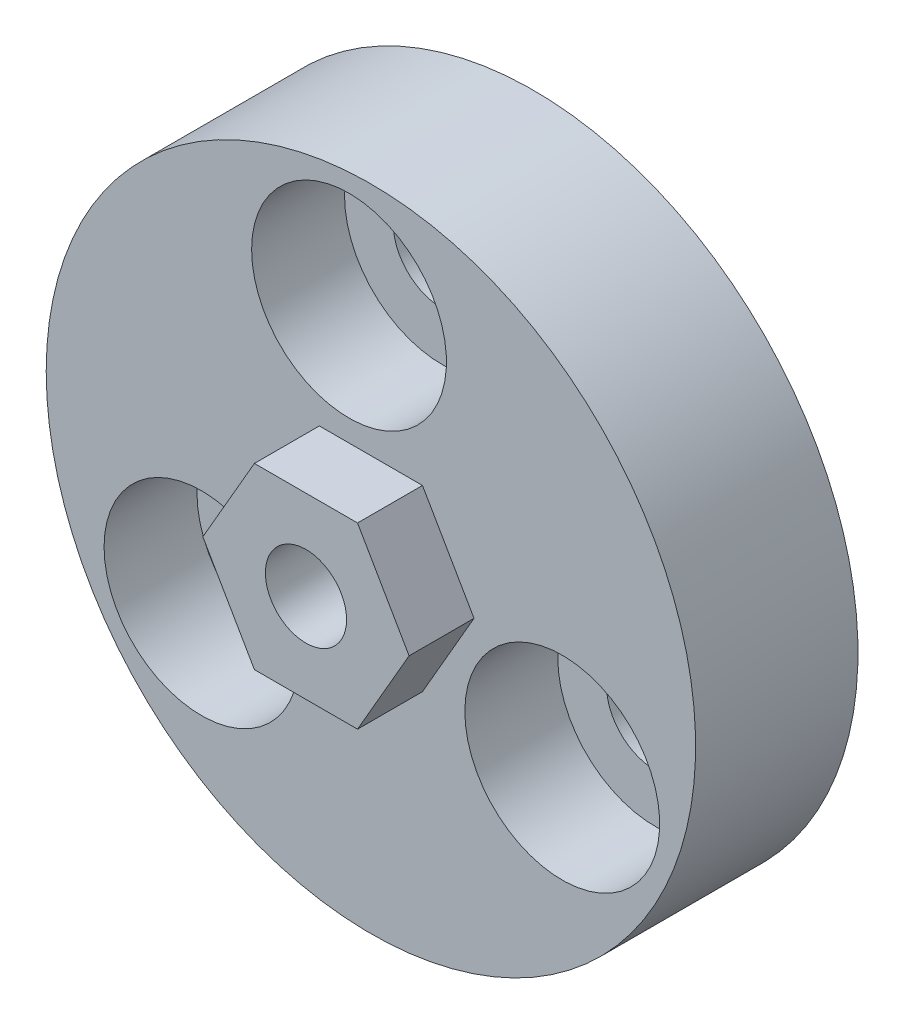
ISO-10303-21;
HEADER;
FILE_DESCRIPTION(('STEP AP214'),'2;1');
FILE_NAME('part.step','',(''),(''),'','','');
FILE_SCHEMA(('AUTOMOTIVE_DESIGN { 1 0 10303 214 1 1 1 1 }'));
ENDSEC;
DATA;
#1=APPLICATION_CONTEXT('core data for automotive mechanical design processes');
#2=APPLICATION_PROTOCOL_DEFINITION('international standard','automotive_design',2000,#1);
#3=PRODUCT_CONTEXT('',#1,'mechanical');
#4=PRODUCT('Part','Part','',(#3));
#5=PRODUCT_RELATED_PRODUCT_CATEGORY('part','',(#4));
#6=PRODUCT_DEFINITION_FORMATION('','',#4);
#7=PRODUCT_DEFINITION_CONTEXT('part definition',#1,'design');
#8=PRODUCT_DEFINITION('design','',#6,#7);
#9=PRODUCT_DEFINITION_SHAPE('','',#8);
#10=(LENGTH_UNIT() NAMED_UNIT(*) SI_UNIT(.MILLI.,.METRE.));
#11=(NAMED_UNIT(*) PLANE_ANGLE_UNIT() SI_UNIT($,.RADIAN.));
#12=(NAMED_UNIT(*) SI_UNIT($,.STERADIAN.) SOLID_ANGLE_UNIT());
#13=UNCERTAINTY_MEASURE_WITH_UNIT(LENGTH_MEASURE(1.E-05),#10,'distance_accuracy_value','');
#14=(GEOMETRIC_REPRESENTATION_CONTEXT(3) GLOBAL_UNCERTAINTY_ASSIGNED_CONTEXT((#13)) GLOBAL_UNIT_ASSIGNED_CONTEXT((#10,
#11,#12)) REPRESENTATION_CONTEXT('',''));
#15=CARTESIAN_POINT('',(0.,0.,0.));
#16=DIRECTION('',(0.,0.,1.));
#17=DIRECTION('',(1.,0.,0.));
#18=AXIS2_PLACEMENT_3D('',#15,#16,#17);
#19=CARTESIAN_POINT('',(-150.000000000003,407.52439115089,-364.357743681072));
#20=DIRECTION('',(0.,0.,1.));
#21=DIRECTION('',(1.,0.,0.));
#22=AXIS2_PLACEMENT_3D('',#19,#20,#21);
#23=PLANE('',#22);
#24=CARTESIAN_POINT('',(-150.000000000003,407.52439115089,-364.357743681072));
#25=DIRECTION('',(0.,0.,1.));
#26=DIRECTION('',(1.,0.,0.));
#27=AXIS2_PLACEMENT_3D('',#24,#25,#26);
#28=CIRCLE('',#27,1.25);
#29=CARTESIAN_POINT('',(-148.750000000003,407.52439115089,-364.357743681072));
#30=VERTEX_POINT('',#29);
#31=EDGE_CURVE('E20',#30,#30,#28,.F.);
#32=ORIENTED_EDGE('',*,*,#31,.T.);
#33=EDGE_LOOP('',(#32));
#34=FACE_BOUND('',#33,.T.);
#35=DIRECTION('',(0.500000000000038,-0.866025403784417,0.));
#36=VECTOR('',#35,1.);
#37=CARTESIAN_POINT('',(-151.587713240275,404.77439115089,-364.357743681072));
#38=LINE('',#37,#36);
#39=CARTESIAN_POINT('',(-151.587713240275,404.77439115089,-364.357743681072));
#40=VERTEX_POINT('',#39);
#41=CARTESIAN_POINT('',(-153.175426480546,407.52439115089,-364.357743681072));
#42=VERTEX_POINT('',#41);
#43=EDGE_CURVE('E68',#40,#42,#38,.F.);
#44=ORIENTED_EDGE('',*,*,#43,.F.);
#45=DIRECTION('',(1.,0.,0.));
#46=VECTOR('',#45,1.);
#47=CARTESIAN_POINT('',(-148.412286759732,404.77439115089,-364.357743681072));
#48=LINE('',#47,#46);
#49=CARTESIAN_POINT('',(-148.412286759732,404.77439115089,-364.357743681072));
#50=VERTEX_POINT('',#49);
#51=EDGE_CURVE('E70',#50,#40,#48,.F.);
#52=ORIENTED_EDGE('',*,*,#51,.F.);
#53=DIRECTION('',(0.5,0.866025403784438,0.));
#54=VECTOR('',#53,1.);
#55=CARTESIAN_POINT('',(-146.824573519461,407.52439115089,-364.357743681072));
#56=LINE('',#55,#54);
#57=CARTESIAN_POINT('',(-146.824573519461,407.52439115089,-364.357743681072));
#58=VERTEX_POINT('',#57);
#59=EDGE_CURVE('E72',#58,#50,#56,.F.);
#60=ORIENTED_EDGE('',*,*,#59,.F.);
#61=DIRECTION('',(-0.499999999999914,0.866025403784488,0.));
#62=VECTOR('',#61,1.);
#63=CARTESIAN_POINT('',(-148.412286759732,410.27439115089,-364.357743681072));
#64=LINE('',#63,#62);
#65=CARTESIAN_POINT('',(-148.412286759732,410.27439115089,-364.357743681072));
#66=VERTEX_POINT('',#65);
#67=EDGE_CURVE('E161',#66,#58,#64,.F.);
#68=ORIENTED_EDGE('',*,*,#67,.F.);
#69=DIRECTION('',(1.,0.,0.));
#70=VECTOR('',#69,1.);
#71=CARTESIAN_POINT('',(-151.587713240275,410.27439115089,-364.357743681072));
#72=LINE('',#71,#70);
#73=CARTESIAN_POINT('',(-151.587713240275,410.27439115089,-364.357743681072));
#74=VERTEX_POINT('',#73);
#75=EDGE_CURVE('E166',#74,#66,#72,.T.);
#76=ORIENTED_EDGE('',*,*,#75,.F.);
#77=DIRECTION('',(-0.5,-0.866025403784438,0.));
#78=VECTOR('',#77,1.);
#79=CARTESIAN_POINT('',(-153.175426480546,407.52439115089,-364.357743681072));
#80=LINE('',#79,#78);
#81=EDGE_CURVE('E171',#42,#74,#80,.F.);
#82=ORIENTED_EDGE('',*,*,#81,.F.);
#83=EDGE_LOOP('',(#44,#52,#60,#68,#76,#82));
#84=FACE_BOUND('',#83,.T.);
#85=ADVANCED_FACE('F17',(#34,#84),#23,.T.);
#86=CARTESIAN_POINT('',(-146.824573519461,407.52439115089,-366.357743681072));
#87=DIRECTION('',(0.866025403784438,-0.5,0.));
#88=DIRECTION('',(0.5,0.866025403784438,0.));
#89=AXIS2_PLACEMENT_3D('',#86,#87,#88);
#90=PLANE('',#89);
#91=DIRECTION('',(-0.499999999999882,-0.866025403784507,0.));
#92=VECTOR('',#91,1.);
#93=CARTESIAN_POINT('',(-146.824573519461,407.52439115089,-366.357743681072));
#94=LINE('',#93,#92);
#95=CARTESIAN_POINT('',(-146.824573519461,407.52439115089,-366.357743681072));
#96=VERTEX_POINT('',#95);
#97=CARTESIAN_POINT('',(-148.412286759732,404.77439115089,-366.357743681072));
#98=VERTEX_POINT('',#97);
#99=EDGE_CURVE('E157',#96,#98,#94,.T.);
#100=ORIENTED_EDGE('',*,*,#99,.F.);
#101=DIRECTION('',(0.,0.,1.));
#102=VECTOR('',#101,1.);
#103=CARTESIAN_POINT('',(-146.824573519461,407.52439115089,-366.357743681072));
#104=LINE('',#103,#102);
#105=EDGE_CURVE('E83',#58,#96,#104,.F.);
#106=ORIENTED_EDGE('',*,*,#105,.F.);
#107=ORIENTED_EDGE('',*,*,#59,.T.);
#108=DIRECTION('',(0.,0.,-1.));
#109=VECTOR('',#108,1.);
#110=CARTESIAN_POINT('',(-148.412286759732,404.77439115089,-366.357743681072));
#111=LINE('',#110,#109);
#112=EDGE_CURVE('E77',#98,#50,#111,.F.);
#113=ORIENTED_EDGE('',*,*,#112,.F.);
#114=EDGE_LOOP('',(#100,#106,#107,#113));
#115=FACE_BOUND('',#114,.T.);
#116=ADVANCED_FACE('F80',(#115),#90,.T.);
#117=CARTESIAN_POINT('',(-148.412286759732,404.77439115089,-366.357743681072));
#118=DIRECTION('',(0.,-1.,0.));
#119=DIRECTION('',(0.,0.,-1.));
#120=AXIS2_PLACEMENT_3D('',#117,#118,#119);
#121=PLANE('',#120);
#122=DIRECTION('',(1.,0.,0.));
#123=VECTOR('',#122,1.);
#124=CARTESIAN_POINT('',(-150.000000000003,404.77439115089,-366.357743681072));
#125=LINE('',#124,#123);
#126=CARTESIAN_POINT('',(-151.587713240275,404.77439115089,-366.357743681072));
#127=VERTEX_POINT('',#126);
#128=EDGE_CURVE('E88',#98,#127,#125,.F.);
#129=ORIENTED_EDGE('',*,*,#128,.F.);
#130=ORIENTED_EDGE('',*,*,#112,.T.);
#131=ORIENTED_EDGE('',*,*,#51,.T.);
#132=DIRECTION('',(0.,0.,1.));
#133=VECTOR('',#132,1.);
#134=CARTESIAN_POINT('',(-151.587713240275,404.77439115089,-366.357743681072));
#135=LINE('',#134,#133);
#136=EDGE_CURVE('E91',#127,#40,#135,.T.);
#137=ORIENTED_EDGE('',*,*,#136,.F.);
#138=EDGE_LOOP('',(#129,#130,#131,#137));
#139=FACE_BOUND('',#138,.T.);
#140=ADVANCED_FACE('F86',(#139),#121,.T.);
#141=CARTESIAN_POINT('',(-151.587713240275,404.77439115089,-366.357743681072));
#142=DIRECTION('',(-0.866025403784417,-0.500000000000038,0.));
#143=DIRECTION('',(0.500000000000038,-0.866025403784417,0.));
#144=AXIS2_PLACEMENT_3D('',#141,#142,#143);
#145=PLANE('',#144);
#146=DIRECTION('',(-0.499999999999888,0.866025403784503,0.));
#147=VECTOR('',#146,1.);
#148=CARTESIAN_POINT('',(-151.587713240275,404.77439115089,-366.357743681072));
#149=LINE('',#148,#147);
#150=CARTESIAN_POINT('',(-153.175426480546,407.52439115089,-366.357743681072));
#151=VERTEX_POINT('',#150);
#152=EDGE_CURVE('E153',#127,#151,#149,.T.);
#153=ORIENTED_EDGE('',*,*,#152,.F.);
#154=ORIENTED_EDGE('',*,*,#136,.T.);
#155=ORIENTED_EDGE('',*,*,#43,.T.);
#156=DIRECTION('',(0.,0.,1.));
#157=VECTOR('',#156,1.);
#158=CARTESIAN_POINT('',(-153.175426480546,407.52439115089,-366.357743681072));
#159=LINE('',#158,#157);
#160=EDGE_CURVE('E168',#151,#42,#159,.T.);
#161=ORIENTED_EDGE('',*,*,#160,.F.);
#162=EDGE_LOOP('',(#153,#154,#155,#161));
#163=FACE_BOUND('',#162,.T.);
#164=ADVANCED_FACE('F175',(#163),#145,.T.);
#165=CARTESIAN_POINT('',(-153.175426480546,407.52439115089,-366.357743681072));
#166=DIRECTION('',(-0.866025403784438,0.5,0.));
#167=DIRECTION('',(-0.5,-0.866025403784438,0.));
#168=AXIS2_PLACEMENT_3D('',#165,#166,#167);
#169=PLANE('',#168);
#170=DIRECTION('',(0.499999999999896,0.866025403784499,0.));
#171=VECTOR('',#170,1.);
#172=CARTESIAN_POINT('',(-153.175426480546,407.52439115089,-366.357743681072));
#173=LINE('',#172,#171);
#174=CARTESIAN_POINT('',(-151.587713240275,410.27439115089,-366.357743681072));
#175=VERTEX_POINT('',#174);
#176=EDGE_CURVE('E148',#151,#175,#173,.T.);
#177=ORIENTED_EDGE('',*,*,#176,.F.);
#178=ORIENTED_EDGE('',*,*,#160,.T.);
#179=ORIENTED_EDGE('',*,*,#81,.T.);
#180=DIRECTION('',(0.,0.,1.));
#181=VECTOR('',#180,1.);
#182=CARTESIAN_POINT('',(-151.587713240275,410.27439115089,-366.357743681072));
#183=LINE('',#182,#181);
#184=EDGE_CURVE('E163',#175,#74,#183,.T.);
#185=ORIENTED_EDGE('',*,*,#184,.F.);
#186=EDGE_LOOP('',(#177,#178,#179,#185));
#187=FACE_BOUND('',#186,.T.);
#188=ADVANCED_FACE('F183',(#187),#169,.T.);
#189=CARTESIAN_POINT('',(-151.587713240275,410.27439115089,-366.357743681072));
#190=DIRECTION('',(0.,1.,0.));
#191=DIRECTION('',(0.,0.,1.));
#192=AXIS2_PLACEMENT_3D('',#189,#190,#191);
#193=PLANE('',#192);
#194=DIRECTION('',(1.,0.,0.));
#195=VECTOR('',#194,1.);
#196=CARTESIAN_POINT('',(-150.000000000003,410.27439115089,-366.357743681072));
#197=LINE('',#196,#195);
#198=CARTESIAN_POINT('',(-148.412286759732,410.27439115089,-366.357743681072));
#199=VERTEX_POINT('',#198);
#200=EDGE_CURVE('E144',#175,#199,#197,.T.);
#201=ORIENTED_EDGE('',*,*,#200,.F.);
#202=ORIENTED_EDGE('',*,*,#184,.T.);
#203=ORIENTED_EDGE('',*,*,#75,.T.);
#204=DIRECTION('',(0.,0.,1.));
#205=VECTOR('',#204,1.);
#206=CARTESIAN_POINT('',(-148.412286759732,410.27439115089,-366.357743681072));
#207=LINE('',#206,#205);
#208=EDGE_CURVE('E35',#199,#66,#207,.T.);
#209=ORIENTED_EDGE('',*,*,#208,.F.);
#210=EDGE_LOOP('',(#201,#202,#203,#209));
#211=FACE_BOUND('',#210,.T.);
#212=ADVANCED_FACE('F181',(#211),#193,.T.);
#213=CARTESIAN_POINT('',(-148.412286759732,410.27439115089,-366.357743681072));
#214=DIRECTION('',(0.866025403784488,0.499999999999914,0.));
#215=DIRECTION('',(-0.499999999999914,0.866025403784488,0.));
#216=AXIS2_PLACEMENT_3D('',#213,#214,#215);
#217=PLANE('',#216);
#218=DIRECTION('',(0.499999999999889,-0.866025403784503,0.));
#219=VECTOR('',#218,1.);
#220=CARTESIAN_POINT('',(-148.412286759732,410.27439115089,-366.357743681072));
#221=LINE('',#220,#219);
#222=EDGE_CURVE('E140',#199,#96,#221,.T.);
#223=ORIENTED_EDGE('',*,*,#222,.F.);
#224=ORIENTED_EDGE('',*,*,#208,.T.);
#225=ORIENTED_EDGE('',*,*,#67,.T.);
#226=ORIENTED_EDGE('',*,*,#105,.T.);
#227=EDGE_LOOP('',(#223,#224,#225,#226));
#228=FACE_BOUND('',#227,.T.);
#229=ADVANCED_FACE('F180',(#228),#217,.T.);
#230=CARTESIAN_POINT('',(-144.107631798208,404.900939803051,-367.719674790643));
#231=DIRECTION('',(0.,0.,-1.));
#232=DIRECTION('',(-1.,0.,0.));
#233=AXIS2_PLACEMENT_3D('',#230,#231,#232);
#234=CYLINDRICAL_SURFACE('',#233,3.);
#235=CARTESIAN_POINT('',(-144.107631798208,404.900939803051,-369.219674790643));
#236=DIRECTION('',(0.,0.,-1.));
#237=DIRECTION('',(-1.,0.,0.));
#238=AXIS2_PLACEMENT_3D('',#235,#236,#237);
#239=CIRCLE('',#238,3.);
#240=CARTESIAN_POINT('',(-147.107631798208,404.900939803051,-369.219674790643));
#241=VERTEX_POINT('',#240);
#242=EDGE_CURVE('E130',#241,#241,#239,.T.);
#243=ORIENTED_EDGE('',*,*,#242,.T.);
#244=EDGE_LOOP('',(#243));
#245=FACE_BOUND('',#244,.T.);
#246=CARTESIAN_POINT('',(-144.107631798208,404.900939803051,-366.357743681072));
#247=DIRECTION('',(0.,0.,-1.));
#248=DIRECTION('',(-1.,0.,0.));
#249=AXIS2_PLACEMENT_3D('',#246,#247,#248);
#250=CIRCLE('',#249,3.);
#251=CARTESIAN_POINT('',(-147.107631798208,404.900939803051,-366.357743681072));
#252=VERTEX_POINT('',#251);
#253=EDGE_CURVE('E138',#252,#252,#250,.T.);
#254=ORIENTED_EDGE('',*,*,#253,.F.);
#255=EDGE_LOOP('',(#254));
#256=FACE_BOUND('',#255,.T.);
#257=ADVANCED_FACE('F251',(#245,#256),#234,.F.);
#258=CARTESIAN_POINT('',(-155.21815961372,403.733176273602,-367.719674790643));
#259=DIRECTION('',(0.,0.,-1.));
#260=DIRECTION('',(-1.,0.,0.));
#261=AXIS2_PLACEMENT_3D('',#258,#259,#260);
#262=CYLINDRICAL_SURFACE('',#261,3.);
#263=CARTESIAN_POINT('',(-155.21815961372,403.733176273602,-369.219674790643));
#264=DIRECTION('',(0.,0.,-1.));
#265=DIRECTION('',(-1.,0.,0.));
#266=AXIS2_PLACEMENT_3D('',#263,#264,#265);
#267=CIRCLE('',#266,3.);
#268=CARTESIAN_POINT('',(-158.21815961372,403.733176273602,-369.219674790643));
#269=VERTEX_POINT('',#268);
#270=EDGE_CURVE('E127',#269,#269,#267,.T.);
#271=ORIENTED_EDGE('',*,*,#270,.T.);
#272=EDGE_LOOP('',(#271));
#273=FACE_BOUND('',#272,.T.);
#274=CARTESIAN_POINT('',(-155.21815961372,403.733176273602,-366.357743681072));
#275=DIRECTION('',(0.,0.,-1.));
#276=DIRECTION('',(-1.,0.,0.));
#277=AXIS2_PLACEMENT_3D('',#274,#275,#276);
#278=CIRCLE('',#277,3.);
#279=CARTESIAN_POINT('',(-158.21815961372,403.733176273602,-366.357743681072));
#280=VERTEX_POINT('',#279);
#281=EDGE_CURVE('E136',#280,#280,#278,.T.);
#282=ORIENTED_EDGE('',*,*,#281,.F.);
#283=EDGE_LOOP('',(#282));
#284=FACE_BOUND('',#283,.T.);
#285=ADVANCED_FACE('F247',(#273,#284),#262,.F.);
#286=CARTESIAN_POINT('',(-150.67420858808,413.939057376015,-367.719674790643));
#287=DIRECTION('',(0.,0.,-1.));
#288=DIRECTION('',(-1.,0.,0.));
#289=AXIS2_PLACEMENT_3D('',#286,#287,#288);
#290=CYLINDRICAL_SURFACE('',#289,3.);
#291=CARTESIAN_POINT('',(-150.67420858808,413.939057376015,-369.219674790643));
#292=DIRECTION('',(0.,0.,-1.));
#293=DIRECTION('',(-1.,0.,0.));
#294=AXIS2_PLACEMENT_3D('',#291,#292,#293);
#295=CIRCLE('',#294,3.);
#296=CARTESIAN_POINT('',(-153.67420858808,413.939057376015,-369.219674790643));
#297=VERTEX_POINT('',#296);
#298=EDGE_CURVE('E124',#297,#297,#295,.T.);
#299=ORIENTED_EDGE('',*,*,#298,.T.);
#300=EDGE_LOOP('',(#299));
#301=FACE_BOUND('',#300,.T.);
#302=CARTESIAN_POINT('',(-150.67420858808,413.939057376015,-366.357743681072));
#303=DIRECTION('',(0.,0.,-1.));
#304=DIRECTION('',(-1.,0.,0.));
#305=AXIS2_PLACEMENT_3D('',#302,#303,#304);
#306=CIRCLE('',#305,3.);
#307=CARTESIAN_POINT('',(-153.67420858808,413.939057376015,-366.357743681072));
#308=VERTEX_POINT('',#307);
#309=EDGE_CURVE('E133',#308,#308,#306,.T.);
#310=ORIENTED_EDGE('',*,*,#309,.F.);
#311=EDGE_LOOP('',(#310));
#312=FACE_BOUND('',#311,.T.);
#313=ADVANCED_FACE('F243',(#301,#312),#290,.F.);
#314=CARTESIAN_POINT('',(-150.000000000003,407.52439115089,-362.423969756685));
#315=DIRECTION('',(0.,0.,1.));
#316=DIRECTION('',(1.,0.,0.));
#317=AXIS2_PLACEMENT_3D('',#314,#315,#316);
#318=CYLINDRICAL_SURFACE('',#317,1.25);
#319=ORIENTED_EDGE('',*,*,#31,.F.);
#320=EDGE_LOOP('',(#319));
#321=FACE_BOUND('',#320,.T.);
#322=CARTESIAN_POINT('',(-150.000000000003,407.52439115089,-369.357743681072));
#323=DIRECTION('',(0.,0.,1.));
#324=DIRECTION('',(1.,0.,0.));
#325=AXIS2_PLACEMENT_3D('',#322,#323,#324);
#326=CIRCLE('',#325,1.25);
#327=CARTESIAN_POINT('',(-148.750000000003,407.52439115089,-369.357743681072));
#328=VERTEX_POINT('',#327);
#329=EDGE_CURVE('E121',#328,#328,#326,.F.);
#330=ORIENTED_EDGE('',*,*,#329,.T.);
#331=EDGE_LOOP('',(#330));
#332=FACE_BOUND('',#331,.T.);
#333=ADVANCED_FACE('F239',(#321,#332),#318,.F.);
#334=CARTESIAN_POINT('',(-150.000000000003,407.52439115089,-366.357743681072));
#335=DIRECTION('',(0.,0.,1.));
#336=DIRECTION('',(1.,0.,0.));
#337=AXIS2_PLACEMENT_3D('',#334,#335,#336);
#338=PLANE('',#337);
#339=ORIENTED_EDGE('',*,*,#309,.T.);
#340=EDGE_LOOP('',(#339));
#341=FACE_BOUND('',#340,.T.);
#342=ORIENTED_EDGE('',*,*,#281,.T.);
#343=EDGE_LOOP('',(#342));
#344=FACE_BOUND('',#343,.T.);
#345=ORIENTED_EDGE('',*,*,#253,.T.);
#346=EDGE_LOOP('',(#345));
#347=FACE_BOUND('',#346,.T.);
#348=ORIENTED_EDGE('',*,*,#200,.T.);
#349=ORIENTED_EDGE('',*,*,#222,.T.);
#350=ORIENTED_EDGE('',*,*,#99,.T.);
#351=ORIENTED_EDGE('',*,*,#128,.T.);
#352=ORIENTED_EDGE('',*,*,#152,.T.);
#353=ORIENTED_EDGE('',*,*,#176,.T.);
#354=EDGE_LOOP('',(#348,#349,#350,#351,#352,#353));
#355=FACE_BOUND('',#354,.T.);
#356=CARTESIAN_POINT('',(-150.000000000003,407.52439115089,-366.357743681072));
#357=DIRECTION('',(0.,0.,-1.));
#358=DIRECTION('',(-1.,0.,0.));
#359=AXIS2_PLACEMENT_3D('',#356,#357,#358);
#360=CIRCLE('',#359,10.);
#361=CARTESIAN_POINT('',(-160.000000000003,407.52439115089,-366.357743681072));
#362=VERTEX_POINT('',#361);
#363=EDGE_CURVE('E118',#362,#362,#360,.T.);
#364=ORIENTED_EDGE('',*,*,#363,.F.);
#365=EDGE_LOOP('',(#364));
#366=FACE_BOUND('',#365,.T.);
#367=ADVANCED_FACE('F177',(#341,#344,#347,#355,#366),#338,.T.);
#368=CARTESIAN_POINT('',(-144.107631798208,404.900939803051,-369.219674790643));
#369=DIRECTION('',(0.,0.,-1.));
#370=DIRECTION('',(-1.,0.,0.));
#371=AXIS2_PLACEMENT_3D('',#368,#369,#370);
#372=PLANE('',#371);
#373=CARTESIAN_POINT('',(-144.107631798208,404.900939803051,-369.219674790643));
#374=DIRECTION('',(0.,0.,-1.));
#375=DIRECTION('',(-1.,0.,0.));
#376=AXIS2_PLACEMENT_3D('',#373,#374,#375);
#377=CIRCLE('',#376,1.5);
#378=CARTESIAN_POINT('',(-145.607631798208,404.900939803051,-369.219674790643));
#379=VERTEX_POINT('',#378);
#380=EDGE_CURVE('E115',#379,#379,#377,.T.);
#381=ORIENTED_EDGE('',*,*,#380,.T.);
#382=EDGE_LOOP('',(#381));
#383=FACE_BOUND('',#382,.T.);
#384=ORIENTED_EDGE('',*,*,#242,.F.);
#385=EDGE_LOOP('',(#384));
#386=FACE_BOUND('',#385,.T.);
#387=ADVANCED_FACE('F232',(#383,#386),#372,.F.);
#388=CARTESIAN_POINT('',(-155.21815961372,403.733176273602,-369.219674790643));
#389=DIRECTION('',(0.,0.,-1.));
#390=DIRECTION('',(-1.,0.,0.));
#391=AXIS2_PLACEMENT_3D('',#388,#389,#390);
#392=PLANE('',#391);
#393=CARTESIAN_POINT('',(-155.21815961372,403.733176273602,-369.219674790643));
#394=DIRECTION('',(0.,0.,-1.));
#395=DIRECTION('',(-1.,0.,0.));
#396=AXIS2_PLACEMENT_3D('',#393,#394,#395);
#397=CIRCLE('',#396,1.5);
#398=CARTESIAN_POINT('',(-156.71815961372,403.733176273602,-369.219674790643));
#399=VERTEX_POINT('',#398);
#400=EDGE_CURVE('E112',#399,#399,#397,.T.);
#401=ORIENTED_EDGE('',*,*,#400,.T.);
#402=EDGE_LOOP('',(#401));
#403=FACE_BOUND('',#402,.T.);
#404=ORIENTED_EDGE('',*,*,#270,.F.);
#405=EDGE_LOOP('',(#404));
#406=FACE_BOUND('',#405,.T.);
#407=ADVANCED_FACE('F228',(#403,#406),#392,.F.);
#408=CARTESIAN_POINT('',(-150.67420858808,413.939057376015,-369.219674790643));
#409=DIRECTION('',(0.,0.,-1.));
#410=DIRECTION('',(-1.,0.,0.));
#411=AXIS2_PLACEMENT_3D('',#408,#409,#410);
#412=PLANE('',#411);
#413=CARTESIAN_POINT('',(-150.67420858808,413.939057376015,-369.219674790643));
#414=DIRECTION('',(0.,0.,-1.));
#415=DIRECTION('',(-1.,0.,0.));
#416=AXIS2_PLACEMENT_3D('',#413,#414,#415);
#417=CIRCLE('',#416,1.5);
#418=CARTESIAN_POINT('',(-152.17420858808,413.939057376015,-369.219674790643));
#419=VERTEX_POINT('',#418);
#420=EDGE_CURVE('E109',#419,#419,#417,.T.);
#421=ORIENTED_EDGE('',*,*,#420,.T.);
#422=EDGE_LOOP('',(#421));
#423=FACE_BOUND('',#422,.T.);
#424=ORIENTED_EDGE('',*,*,#298,.F.);
#425=EDGE_LOOP('',(#424));
#426=FACE_BOUND('',#425,.T.);
#427=ADVANCED_FACE('F224',(#423,#426),#412,.F.);
#428=CARTESIAN_POINT('',(-150.000000000003,407.52439115089,-369.357743681072));
#429=DIRECTION('',(0.,0.,1.));
#430=DIRECTION('',(1.,0.,0.));
#431=AXIS2_PLACEMENT_3D('',#428,#429,#430);
#432=PLANE('',#431);
#433=ORIENTED_EDGE('',*,*,#329,.F.);
#434=EDGE_LOOP('',(#433));
#435=FACE_BOUND('',#434,.T.);
#436=CARTESIAN_POINT('',(-150.000000000003,407.52439115089,-369.357743681072));
#437=DIRECTION('',(0.,0.,1.));
#438=DIRECTION('',(1.,0.,0.));
#439=AXIS2_PLACEMENT_3D('',#436,#437,#438);
#440=CIRCLE('',#439,4.5);
#441=CARTESIAN_POINT('',(-145.500000000003,407.52439115089,-369.357743681072));
#442=VERTEX_POINT('',#441);
#443=EDGE_CURVE('E106',#442,#442,#440,.F.);
#444=ORIENTED_EDGE('',*,*,#443,.T.);
#445=EDGE_LOOP('',(#444));
#446=FACE_BOUND('',#445,.T.);
#447=ADVANCED_FACE('F220',(#435,#446),#432,.F.);
#448=CARTESIAN_POINT('',(-150.000000000003,407.52439115089,-368.857743681072));
#449=DIRECTION('',(0.,0.,-1.));
#450=DIRECTION('',(-1.,0.,0.));
#451=AXIS2_PLACEMENT_3D('',#448,#449,#450);
#452=CYLINDRICAL_SURFACE('',#451,10.);
#453=CARTESIAN_POINT('',(-150.000000000003,407.52439115089,-371.357743681072));
#454=DIRECTION('',(0.,0.,-1.));
#455=DIRECTION('',(-1.,0.,0.));
#456=AXIS2_PLACEMENT_3D('',#453,#454,#455);
#457=CIRCLE('',#456,10.);
#458=CARTESIAN_POINT('',(-160.000000000003,407.52439115089,-371.357743681072));
#459=VERTEX_POINT('',#458);
#460=EDGE_CURVE('E103',#459,#459,#457,.T.);
#461=ORIENTED_EDGE('',*,*,#460,.F.);
#462=EDGE_LOOP('',(#461));
#463=FACE_BOUND('',#462,.T.);
#464=ORIENTED_EDGE('',*,*,#363,.T.);
#465=EDGE_LOOP('',(#464));
#466=FACE_BOUND('',#465,.T.);
#467=ADVANCED_FACE('F216',(#463,#466),#452,.T.);
#468=CARTESIAN_POINT('',(-144.107631798208,404.900939803051,-368.788709235857));
#469=DIRECTION('',(0.,0.,-1.));
#470=DIRECTION('',(-1.,0.,0.));
#471=AXIS2_PLACEMENT_3D('',#468,#469,#470);
#472=CYLINDRICAL_SURFACE('',#471,1.5);
#473=CARTESIAN_POINT('',(-144.107631798208,404.900939803051,-371.357743681072));
#474=DIRECTION('',(0.,0.,-1.));
#475=DIRECTION('',(-1.,0.,0.));
#476=AXIS2_PLACEMENT_3D('',#473,#474,#475);
#477=CIRCLE('',#476,1.5);
#478=CARTESIAN_POINT('',(-145.607631798208,404.900939803051,-371.357743681072));
#479=VERTEX_POINT('',#478);
#480=EDGE_CURVE('E100',#479,#479,#477,.F.);
#481=ORIENTED_EDGE('',*,*,#480,.F.);
#482=EDGE_LOOP('',(#481));
#483=FACE_BOUND('',#482,.T.);
#484=ORIENTED_EDGE('',*,*,#380,.F.);
#485=EDGE_LOOP('',(#484));
#486=FACE_BOUND('',#485,.T.);
#487=ADVANCED_FACE('F212',(#483,#486),#472,.F.);
#488=CARTESIAN_POINT('',(-155.21815961372,403.733176273602,-368.788709235857));
#489=DIRECTION('',(0.,0.,-1.));
#490=DIRECTION('',(-1.,0.,0.));
#491=AXIS2_PLACEMENT_3D('',#488,#489,#490);
#492=CYLINDRICAL_SURFACE('',#491,1.5);
#493=CARTESIAN_POINT('',(-155.21815961372,403.733176273602,-371.357743681072));
#494=DIRECTION('',(0.,0.,-1.));
#495=DIRECTION('',(-1.,0.,0.));
#496=AXIS2_PLACEMENT_3D('',#493,#494,#495);
#497=CIRCLE('',#496,1.5);
#498=CARTESIAN_POINT('',(-156.71815961372,403.733176273602,-371.357743681072));
#499=VERTEX_POINT('',#498);
#500=EDGE_CURVE('E97',#499,#499,#497,.F.);
#501=ORIENTED_EDGE('',*,*,#500,.F.);
#502=EDGE_LOOP('',(#501));
#503=FACE_BOUND('',#502,.T.);
#504=ORIENTED_EDGE('',*,*,#400,.F.);
#505=EDGE_LOOP('',(#504));
#506=FACE_BOUND('',#505,.T.);
#507=ADVANCED_FACE('F208',(#503,#506),#492,.F.);
#508=CARTESIAN_POINT('',(-150.67420858808,413.939057376015,-368.788709235857));
#509=DIRECTION('',(0.,0.,-1.));
#510=DIRECTION('',(-1.,0.,0.));
#511=AXIS2_PLACEMENT_3D('',#508,#509,#510);
#512=CYLINDRICAL_SURFACE('',#511,1.5);
#513=CARTESIAN_POINT('',(-150.67420858808,413.939057376015,-371.357743681072));
#514=DIRECTION('',(0.,0.,-1.));
#515=DIRECTION('',(-1.,0.,0.));
#516=AXIS2_PLACEMENT_3D('',#513,#514,#515);
#517=CIRCLE('',#516,1.5);
#518=CARTESIAN_POINT('',(-152.17420858808,413.939057376015,-371.357743681072));
#519=VERTEX_POINT('',#518);
#520=EDGE_CURVE('E26',#519,#519,#517,.F.);
#521=ORIENTED_EDGE('',*,*,#520,.F.);
#522=EDGE_LOOP('',(#521));
#523=FACE_BOUND('',#522,.T.);
#524=ORIENTED_EDGE('',*,*,#420,.F.);
#525=EDGE_LOOP('',(#524));
#526=FACE_BOUND('',#525,.T.);
#527=ADVANCED_FACE('F201',(#523,#526),#512,.F.);
#528=CARTESIAN_POINT('',(-150.000000000003,407.52439115089,-370.357743681072));
#529=DIRECTION('',(0.,0.,1.));
#530=DIRECTION('',(1.,0.,0.));
#531=AXIS2_PLACEMENT_3D('',#528,#529,#530);
#532=CYLINDRICAL_SURFACE('',#531,4.5);
#533=CARTESIAN_POINT('',(-150.000000000003,407.52439115089,-371.357743681072));
#534=DIRECTION('',(0.,0.,1.));
#535=DIRECTION('',(1.,0.,0.));
#536=AXIS2_PLACEMENT_3D('',#533,#534,#535);
#537=CIRCLE('',#536,4.5);
#538=CARTESIAN_POINT('',(-145.500000000003,407.52439115089,-371.357743681072));
#539=VERTEX_POINT('',#538);
#540=EDGE_CURVE('E11',#539,#539,#537,.T.);
#541=ORIENTED_EDGE('',*,*,#540,.F.);
#542=EDGE_LOOP('',(#541));
#543=FACE_BOUND('',#542,.T.);
#544=ORIENTED_EDGE('',*,*,#443,.F.);
#545=EDGE_LOOP('',(#544));
#546=FACE_BOUND('',#545,.T.);
#547=ADVANCED_FACE('F195',(#543,#546),#532,.F.);
#548=CARTESIAN_POINT('',(-150.000000000003,407.52439115089,-371.357743681072));
#549=DIRECTION('',(0.,0.,-1.));
#550=DIRECTION('',(-1.,0.,0.));
#551=AXIS2_PLACEMENT_3D('',#548,#549,#550);
#552=PLANE('',#551);
#553=ORIENTED_EDGE('',*,*,#540,.T.);
#554=EDGE_LOOP('',(#553));
#555=FACE_BOUND('',#554,.T.);
#556=ORIENTED_EDGE('',*,*,#520,.T.);
#557=EDGE_LOOP('',(#556));
#558=FACE_BOUND('',#557,.T.);
#559=ORIENTED_EDGE('',*,*,#500,.T.);
#560=EDGE_LOOP('',(#559));
#561=FACE_BOUND('',#560,.T.);
#562=ORIENTED_EDGE('',*,*,#480,.T.);
#563=EDGE_LOOP('',(#562));
#564=FACE_BOUND('',#563,.T.);
#565=ORIENTED_EDGE('',*,*,#460,.T.);
#566=EDGE_LOOP('',(#565));
#567=FACE_BOUND('',#566,.T.);
#568=ADVANCED_FACE('F193',(#555,#558,#561,#564,#567),#552,.T.);
#569=CLOSED_SHELL('',(#85,#116,#140,#164,#188,#212,#229,#257,#285,#313,#333,#367,#387,#407,#427,
#447,#467,#487,#507,#527,#547,#568));
#570=MANIFOLD_SOLID_BREP('B1',#569);
#571=ADVANCED_BREP_SHAPE_REPRESENTATION('',(#18,#570),#14);
#572=SHAPE_DEFINITION_REPRESENTATION(#9,#571);
ENDSEC;
END-ISO-10303-21;
